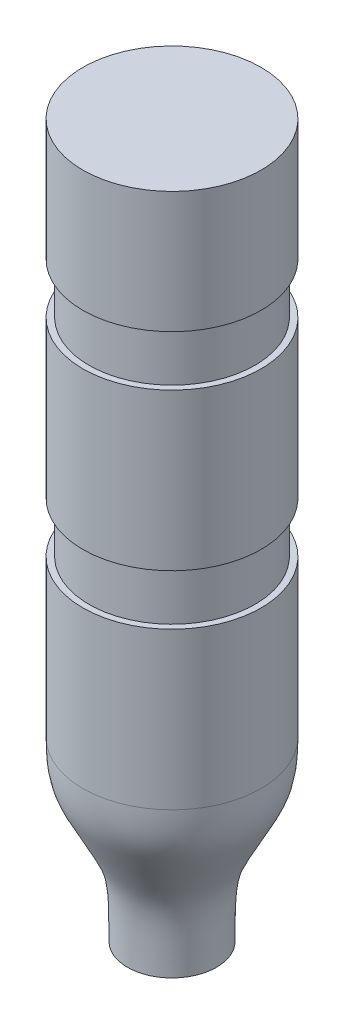
ISO-10303-21;
HEADER;
FILE_DESCRIPTION(('STEP AP214'),'2;1');
FILE_NAME('part.step','',(''),(''),'','','');
FILE_SCHEMA(('AUTOMOTIVE_DESIGN { 1 0 10303 214 1 1 1 1 }'));
ENDSEC;
DATA;
#1=APPLICATION_CONTEXT('core data for automotive mechanical design processes');
#2=APPLICATION_PROTOCOL_DEFINITION('international standard','automotive_design',2000,#1);
#3=PRODUCT_CONTEXT('',#1,'mechanical');
#4=PRODUCT('Part','Part','',(#3));
#5=PRODUCT_RELATED_PRODUCT_CATEGORY('part','',(#4));
#6=PRODUCT_DEFINITION_FORMATION('','',#4);
#7=PRODUCT_DEFINITION_CONTEXT('part definition',#1,'design');
#8=PRODUCT_DEFINITION('design','',#6,#7);
#9=PRODUCT_DEFINITION_SHAPE('','',#8);
#10=(LENGTH_UNIT() NAMED_UNIT(*) SI_UNIT(.MILLI.,.METRE.));
#11=(NAMED_UNIT(*) PLANE_ANGLE_UNIT() SI_UNIT($,.RADIAN.));
#12=(NAMED_UNIT(*) SI_UNIT($,.STERADIAN.) SOLID_ANGLE_UNIT());
#13=UNCERTAINTY_MEASURE_WITH_UNIT(LENGTH_MEASURE(1.E-05),#10,'distance_accuracy_value','');
#14=(GEOMETRIC_REPRESENTATION_CONTEXT(3) GLOBAL_UNCERTAINTY_ASSIGNED_CONTEXT((#13)) GLOBAL_UNIT_ASSIGNED_CONTEXT((#10,
#11,#12)) REPRESENTATION_CONTEXT('',''));
#15=CARTESIAN_POINT('',(0.,0.,0.));
#16=DIRECTION('',(0.,0.,1.));
#17=DIRECTION('',(1.,0.,0.));
#18=AXIS2_PLACEMENT_3D('',#15,#16,#17);
#19=CARTESIAN_POINT('',(5.588,-89.408,0.));
#20=DIRECTION('',(0.,-1.,0.));
#21=DIRECTION('',(0.,0.,-1.));
#22=AXIS2_PLACEMENT_3D('',#19,#20,#21);
#23=PLANE('',#22);
#24=CARTESIAN_POINT('',(0.,-89.408,0.));
#25=DIRECTION('',(0.,-1.,0.));
#26=DIRECTION('',(0.,0.,-1.));
#27=AXIS2_PLACEMENT_3D('',#24,#25,#26);
#28=CIRCLE('',#27,5.588);
#29=CARTESIAN_POINT('',(0.,-89.408,-5.588));
#30=VERTEX_POINT('',#29);
#31=EDGE_CURVE('E10',#30,#30,#28,.T.);
#32=ORIENTED_EDGE('',*,*,#31,.T.);
#33=EDGE_LOOP('',(#32));
#34=FACE_BOUND('',#33,.T.);
#35=ADVANCED_FACE('F37',(#34),#23,.T.);
#36=CARTESIAN_POINT('',(5.588,-89.408,0.));
#37=CARTESIAN_POINT('',(5.588,-82.945858670386,0.));
#38=CARTESIAN_POINT('',(5.8108916391246,-81.1765397169384,0.));
#39=CARTESIAN_POINT('',(10.1829397435537,-73.2579823784224,0.));
#40=CARTESIAN_POINT('',(11.176,-70.9514109212654,0.));
#41=CARTESIAN_POINT('',(11.176,-67.191788457202,0.));
#42=B_SPLINE_CURVE_WITH_KNOTS('',3,(#36,#37,#38,#39,#40,#41),.UNSPECIFIED.,.F.,.F.,(4,1,1,4),
(0.,0.45780949096358,0.683550152642754,1.),.UNSPECIFIED.);
#43=CARTESIAN_POINT('',(0.,-89.408,0.));
#44=DIRECTION('',(0.,-1.,0.));
#45=AXIS1_PLACEMENT('',#43,#44);
#46=SURFACE_OF_REVOLUTION('',#42,#45);
#47=CARTESIAN_POINT('',(0.,-67.191788457202,0.));
#48=DIRECTION('',(0.,-1.,0.));
#49=DIRECTION('',(0.,0.,-1.));
#50=AXIS2_PLACEMENT_3D('',#47,#48,#49);
#51=CIRCLE('',#50,11.176);
#52=CARTESIAN_POINT('',(0.,-67.191788457202,-11.176));
#53=VERTEX_POINT('',#52);
#54=EDGE_CURVE('E44',#53,#53,#51,.T.);
#55=ORIENTED_EDGE('',*,*,#54,.T.);
#56=EDGE_LOOP('',(#55));
#57=FACE_BOUND('',#56,.T.);
#58=ORIENTED_EDGE('',*,*,#31,.F.);
#59=EDGE_LOOP('',(#58));
#60=FACE_BOUND('',#59,.T.);
#61=ADVANCED_FACE('F94',(#57,#60),#46,.F.);
#62=CARTESIAN_POINT('',(0.,-89.408,0.));
#63=DIRECTION('',(0.,-1.,0.));
#64=DIRECTION('',(0.,0.,-1.));
#65=AXIS2_PLACEMENT_3D('',#62,#63,#64);
#66=CYLINDRICAL_SURFACE('',#65,11.176);
#67=CARTESIAN_POINT('',(0.,-47.565894228601,0.));
#68=DIRECTION('',(0.,-1.,0.));
#69=DIRECTION('',(0.,0.,-1.));
#70=AXIS2_PLACEMENT_3D('',#67,#68,#69);
#71=CIRCLE('',#70,11.176);
#72=CARTESIAN_POINT('',(0.,-47.565894228601,-11.176));
#73=VERTEX_POINT('',#72);
#74=EDGE_CURVE('E49',#73,#73,#71,.T.);
#75=ORIENTED_EDGE('',*,*,#74,.T.);
#76=EDGE_LOOP('',(#75));
#77=FACE_BOUND('',#76,.T.);
#78=ORIENTED_EDGE('',*,*,#54,.F.);
#79=EDGE_LOOP('',(#78));
#80=FACE_BOUND('',#79,.T.);
#81=ADVANCED_FACE('F97',(#77,#80),#66,.T.);
#82=CARTESIAN_POINT('',(10.414,-47.565894228601,0.));
#83=DIRECTION('',(0.,1.,0.));
#84=DIRECTION('',(0.,0.,1.));
#85=AXIS2_PLACEMENT_3D('',#82,#83,#84);
#86=PLANE('',#85);
#87=CARTESIAN_POINT('',(0.,-47.565894228601,0.));
#88=DIRECTION('',(0.,-1.,0.));
#89=DIRECTION('',(0.,0.,-1.));
#90=AXIS2_PLACEMENT_3D('',#87,#88,#89);
#91=CIRCLE('',#90,10.414);
#92=CARTESIAN_POINT('',(0.,-47.565894228601,-10.414));
#93=VERTEX_POINT('',#92);
#94=EDGE_CURVE('E54',#93,#93,#91,.T.);
#95=ORIENTED_EDGE('',*,*,#94,.T.);
#96=EDGE_LOOP('',(#95));
#97=FACE_BOUND('',#96,.T.);
#98=ORIENTED_EDGE('',*,*,#74,.F.);
#99=EDGE_LOOP('',(#98));
#100=FACE_BOUND('',#99,.T.);
#101=ADVANCED_FACE('F100',(#97,#100),#86,.T.);
#102=CARTESIAN_POINT('',(0.,-89.408,0.));
#103=DIRECTION('',(0.,-1.,0.));
#104=DIRECTION('',(0.,0.,-1.));
#105=AXIS2_PLACEMENT_3D('',#102,#103,#104);
#106=CYLINDRICAL_SURFACE('',#105,10.414);
#107=CARTESIAN_POINT('',(0.,-41.215894228601,0.));
#108=DIRECTION('',(0.,-1.,0.));
#109=DIRECTION('',(0.,0.,-1.));
#110=AXIS2_PLACEMENT_3D('',#107,#108,#109);
#111=CIRCLE('',#110,10.414);
#112=CARTESIAN_POINT('',(0.,-41.215894228601,-10.414));
#113=VERTEX_POINT('',#112);
#114=EDGE_CURVE('E60',#113,#113,#111,.T.);
#115=ORIENTED_EDGE('',*,*,#114,.T.);
#116=EDGE_LOOP('',(#115));
#117=FACE_BOUND('',#116,.T.);
#118=ORIENTED_EDGE('',*,*,#94,.F.);
#119=EDGE_LOOP('',(#118));
#120=FACE_BOUND('',#119,.T.);
#121=ADVANCED_FACE('F104',(#117,#120),#106,.T.);
#122=CARTESIAN_POINT('',(11.176,-41.215894228601,0.));
#123=DIRECTION('',(0.,-1.,0.));
#124=DIRECTION('',(0.,0.,-1.));
#125=AXIS2_PLACEMENT_3D('',#122,#123,#124);
#126=PLANE('',#125);
#127=CARTESIAN_POINT('',(0.,-41.215894228601,0.));
#128=DIRECTION('',(0.,-1.,0.));
#129=DIRECTION('',(0.,0.,-1.));
#130=AXIS2_PLACEMENT_3D('',#127,#128,#129);
#131=CIRCLE('',#130,11.176);
#132=CARTESIAN_POINT('',(0.,-41.215894228601,-11.176));
#133=VERTEX_POINT('',#132);
#134=EDGE_CURVE('E64',#133,#133,#131,.T.);
#135=ORIENTED_EDGE('',*,*,#134,.T.);
#136=EDGE_LOOP('',(#135));
#137=FACE_BOUND('',#136,.T.);
#138=ORIENTED_EDGE('',*,*,#114,.F.);
#139=EDGE_LOOP('',(#138));
#140=FACE_BOUND('',#139,.T.);
#141=ADVANCED_FACE('F108',(#137,#140),#126,.T.);
#142=CARTESIAN_POINT('',(0.,-89.408,0.));
#143=DIRECTION('',(0.,-1.,0.));
#144=DIRECTION('',(0.,0.,-1.));
#145=AXIS2_PLACEMENT_3D('',#142,#143,#144);
#146=CYLINDRICAL_SURFACE('',#145,11.176);
#147=CARTESIAN_POINT('',(0.,-21.59,0.));
#148=DIRECTION('',(0.,-1.,0.));
#149=DIRECTION('',(0.,0.,-1.));
#150=AXIS2_PLACEMENT_3D('',#147,#148,#149);
#151=CIRCLE('',#150,11.176);
#152=CARTESIAN_POINT('',(0.,-21.59,-11.176));
#153=VERTEX_POINT('',#152);
#154=EDGE_CURVE('E68',#153,#153,#151,.T.);
#155=ORIENTED_EDGE('',*,*,#154,.T.);
#156=EDGE_LOOP('',(#155));
#157=FACE_BOUND('',#156,.T.);
#158=ORIENTED_EDGE('',*,*,#134,.F.);
#159=EDGE_LOOP('',(#158));
#160=FACE_BOUND('',#159,.T.);
#161=ADVANCED_FACE('F112',(#157,#160),#146,.T.);
#162=CARTESIAN_POINT('',(10.414,-21.59,0.));
#163=DIRECTION('',(0.,1.,0.));
#164=DIRECTION('',(0.,0.,1.));
#165=AXIS2_PLACEMENT_3D('',#162,#163,#164);
#166=PLANE('',#165);
#167=CARTESIAN_POINT('',(0.,-21.59,0.));
#168=DIRECTION('',(0.,-1.,0.));
#169=DIRECTION('',(0.,0.,-1.));
#170=AXIS2_PLACEMENT_3D('',#167,#168,#169);
#171=CIRCLE('',#170,10.414);
#172=CARTESIAN_POINT('',(0.,-21.59,-10.414));
#173=VERTEX_POINT('',#172);
#174=EDGE_CURVE('E72',#173,#173,#171,.T.);
#175=ORIENTED_EDGE('',*,*,#174,.T.);
#176=EDGE_LOOP('',(#175));
#177=FACE_BOUND('',#176,.T.);
#178=ORIENTED_EDGE('',*,*,#154,.F.);
#179=EDGE_LOOP('',(#178));
#180=FACE_BOUND('',#179,.T.);
#181=ADVANCED_FACE('F116',(#177,#180),#166,.T.);
#182=CARTESIAN_POINT('',(0.,-89.408,0.));
#183=DIRECTION('',(0.,-1.,0.));
#184=DIRECTION('',(0.,0.,-1.));
#185=AXIS2_PLACEMENT_3D('',#182,#183,#184);
#186=CYLINDRICAL_SURFACE('',#185,10.414);
#187=CARTESIAN_POINT('',(0.,-15.24,0.));
#188=DIRECTION('',(0.,-1.,0.));
#189=DIRECTION('',(0.,0.,-1.));
#190=AXIS2_PLACEMENT_3D('',#187,#188,#189);
#191=CIRCLE('',#190,10.414);
#192=CARTESIAN_POINT('',(0.,-15.24,-10.414));
#193=VERTEX_POINT('',#192);
#194=EDGE_CURVE('E76',#193,#193,#191,.T.);
#195=ORIENTED_EDGE('',*,*,#194,.T.);
#196=EDGE_LOOP('',(#195));
#197=FACE_BOUND('',#196,.T.);
#198=ORIENTED_EDGE('',*,*,#174,.F.);
#199=EDGE_LOOP('',(#198));
#200=FACE_BOUND('',#199,.T.);
#201=ADVANCED_FACE('F120',(#197,#200),#186,.T.);
#202=CARTESIAN_POINT('',(11.176,-15.24,0.));
#203=DIRECTION('',(0.,-1.,0.));
#204=DIRECTION('',(0.,0.,-1.));
#205=AXIS2_PLACEMENT_3D('',#202,#203,#204);
#206=PLANE('',#205);
#207=CARTESIAN_POINT('',(0.,-15.24,0.));
#208=DIRECTION('',(0.,-1.,0.));
#209=DIRECTION('',(0.,0.,-1.));
#210=AXIS2_PLACEMENT_3D('',#207,#208,#209);
#211=CIRCLE('',#210,11.176);
#212=CARTESIAN_POINT('',(0.,-15.24,-11.176));
#213=VERTEX_POINT('',#212);
#214=EDGE_CURVE('E80',#213,#213,#211,.T.);
#215=ORIENTED_EDGE('',*,*,#214,.T.);
#216=EDGE_LOOP('',(#215));
#217=FACE_BOUND('',#216,.T.);
#218=ORIENTED_EDGE('',*,*,#194,.F.);
#219=EDGE_LOOP('',(#218));
#220=FACE_BOUND('',#219,.T.);
#221=ADVANCED_FACE('F124',(#217,#220),#206,.T.);
#222=CARTESIAN_POINT('',(0.,-89.408,0.));
#223=DIRECTION('',(0.,-1.,0.));
#224=DIRECTION('',(0.,0.,-1.));
#225=AXIS2_PLACEMENT_3D('',#222,#223,#224);
#226=CYLINDRICAL_SURFACE('',#225,11.176);
#227=CARTESIAN_POINT('',(0.,0.,0.));
#228=DIRECTION('',(0.,-1.,0.));
#229=DIRECTION('',(0.,0.,-1.));
#230=AXIS2_PLACEMENT_3D('',#227,#228,#229);
#231=CIRCLE('',#230,11.176);
#232=CARTESIAN_POINT('',(0.,0.,-11.176));
#233=VERTEX_POINT('',#232);
#234=EDGE_CURVE('E84',#233,#233,#231,.T.);
#235=ORIENTED_EDGE('',*,*,#234,.T.);
#236=EDGE_LOOP('',(#235));
#237=FACE_BOUND('',#236,.T.);
#238=ORIENTED_EDGE('',*,*,#214,.F.);
#239=EDGE_LOOP('',(#238));
#240=FACE_BOUND('',#239,.T.);
#241=ADVANCED_FACE('F128',(#237,#240),#226,.T.);
#242=CARTESIAN_POINT('',(0.,0.,0.));
#243=DIRECTION('',(0.,1.,0.));
#244=DIRECTION('',(0.,0.,1.));
#245=AXIS2_PLACEMENT_3D('',#242,#243,#244);
#246=PLANE('',#245);
#247=ORIENTED_EDGE('',*,*,#234,.F.);
#248=EDGE_LOOP('',(#247));
#249=FACE_BOUND('',#248,.T.);
#250=ADVANCED_FACE('F132',(#249),#246,.T.);
#251=CLOSED_SHELL('',(#35,#61,#81,#101,#121,#141,#161,#181,#201,#221,#241,#250));
#252=MANIFOLD_SOLID_BREP('B2',#251);
#253=ADVANCED_BREP_SHAPE_REPRESENTATION('',(#18,#252),#14);
#254=SHAPE_DEFINITION_REPRESENTATION(#9,#253);
ENDSEC;
END-ISO-10303-21;
